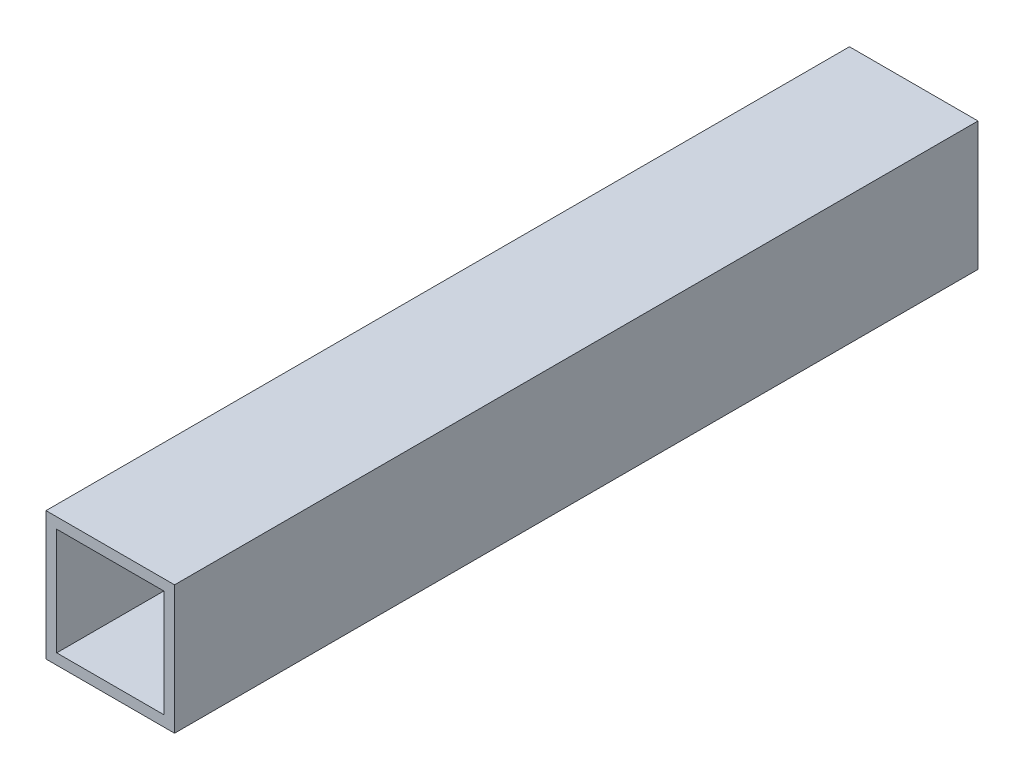
ISO-10303-21;
HEADER;
FILE_DESCRIPTION(('STEP AP214'),'2;1');
FILE_NAME('part.step','',(''),(''),'','','');
FILE_SCHEMA(('AUTOMOTIVE_DESIGN { 1 0 10303 214 1 1 1 1 }'));
ENDSEC;
DATA;
#1=APPLICATION_CONTEXT('core data for automotive mechanical design processes');
#2=APPLICATION_PROTOCOL_DEFINITION('international standard','automotive_design',2000,#1);
#3=PRODUCT_CONTEXT('',#1,'mechanical');
#4=PRODUCT('Part','Part','',(#3));
#5=PRODUCT_RELATED_PRODUCT_CATEGORY('part','',(#4));
#6=PRODUCT_DEFINITION_FORMATION('','',#4);
#7=PRODUCT_DEFINITION_CONTEXT('part definition',#1,'design');
#8=PRODUCT_DEFINITION('design','',#6,#7);
#9=PRODUCT_DEFINITION_SHAPE('','',#8);
#10=(LENGTH_UNIT() NAMED_UNIT(*) SI_UNIT(.MILLI.,.METRE.));
#11=(NAMED_UNIT(*) PLANE_ANGLE_UNIT() SI_UNIT($,.RADIAN.));
#12=(NAMED_UNIT(*) SI_UNIT($,.STERADIAN.) SOLID_ANGLE_UNIT());
#13=UNCERTAINTY_MEASURE_WITH_UNIT(LENGTH_MEASURE(1.E-05),#10,'distance_accuracy_value','');
#14=(GEOMETRIC_REPRESENTATION_CONTEXT(3) GLOBAL_UNCERTAINTY_ASSIGNED_CONTEXT((#13)) GLOBAL_UNIT_ASSIGNED_CONTEXT((#10,
#11,#12)) REPRESENTATION_CONTEXT('',''));
#15=CARTESIAN_POINT('',(0.,0.,0.));
#16=DIRECTION('',(0.,0.,1.));
#17=DIRECTION('',(1.,0.,0.));
#18=AXIS2_PLACEMENT_3D('',#15,#16,#17);
#19=CARTESIAN_POINT('',(0.,0.,75.));
#20=DIRECTION('',(0.,0.,1.));
#21=DIRECTION('',(1.,0.,0.));
#22=AXIS2_PLACEMENT_3D('',#19,#20,#21);
#23=PLANE('',#22);
#24=DIRECTION('',(0.,-1.,0.));
#25=VECTOR('',#24,1.);
#26=CARTESIAN_POINT('',(-12.,12.,75.));
#27=LINE('',#26,#25);
#28=CARTESIAN_POINT('',(-12.,12.,75.));
#29=VERTEX_POINT('',#28);
#30=CARTESIAN_POINT('',(-12.,-12.,75.));
#31=VERTEX_POINT('',#30);
#32=EDGE_CURVE('E136',#29,#31,#27,.T.);
#33=ORIENTED_EDGE('',*,*,#32,.T.);
#34=DIRECTION('',(1.,0.,0.));
#35=VECTOR('',#34,1.);
#36=CARTESIAN_POINT('',(-12.,-12.,75.));
#37=LINE('',#36,#35);
#38=CARTESIAN_POINT('',(12.,-12.,75.));
#39=VERTEX_POINT('',#38);
#40=EDGE_CURVE('E139',#31,#39,#37,.T.);
#41=ORIENTED_EDGE('',*,*,#40,.T.);
#42=DIRECTION('',(0.,1.,0.));
#43=VECTOR('',#42,1.);
#44=CARTESIAN_POINT('',(12.,12.,75.));
#45=LINE('',#44,#43);
#46=CARTESIAN_POINT('',(12.,12.,75.));
#47=VERTEX_POINT('',#46);
#48=EDGE_CURVE('E142',#39,#47,#45,.T.);
#49=ORIENTED_EDGE('',*,*,#48,.T.);
#50=DIRECTION('',(-1.,0.,0.));
#51=VECTOR('',#50,1.);
#52=CARTESIAN_POINT('',(-12.,12.,75.));
#53=LINE('',#52,#51);
#54=EDGE_CURVE('E144',#47,#29,#53,.T.);
#55=ORIENTED_EDGE('',*,*,#54,.T.);
#56=EDGE_LOOP('',(#33,#41,#49,#55));
#57=FACE_BOUND('',#56,.T.);
#58=DIRECTION('',(-1.,0.,0.));
#59=VECTOR('',#58,1.);
#60=CARTESIAN_POINT('',(-10.,10.,75.));
#61=LINE('',#60,#59);
#62=CARTESIAN_POINT('',(10.,10.,75.));
#63=VERTEX_POINT('',#62);
#64=CARTESIAN_POINT('',(-10.,10.,75.));
#65=VERTEX_POINT('',#64);
#66=EDGE_CURVE('E108',#63,#65,#61,.T.);
#67=ORIENTED_EDGE('',*,*,#66,.F.);
#68=DIRECTION('',(0.,1.,0.));
#69=VECTOR('',#68,1.);
#70=CARTESIAN_POINT('',(10.,10.,75.));
#71=LINE('',#70,#69);
#72=CARTESIAN_POINT('',(10.,-10.,75.));
#73=VERTEX_POINT('',#72);
#74=EDGE_CURVE('E100',#73,#63,#71,.T.);
#75=ORIENTED_EDGE('',*,*,#74,.F.);
#76=DIRECTION('',(1.,0.,0.));
#77=VECTOR('',#76,1.);
#78=CARTESIAN_POINT('',(-10.,-10.,75.));
#79=LINE('',#78,#77);
#80=CARTESIAN_POINT('',(-10.,-10.,75.));
#81=VERTEX_POINT('',#80);
#82=EDGE_CURVE('E122',#81,#73,#79,.T.);
#83=ORIENTED_EDGE('',*,*,#82,.F.);
#84=DIRECTION('',(0.,-1.,0.));
#85=VECTOR('',#84,1.);
#86=CARTESIAN_POINT('',(-10.,10.,75.));
#87=LINE('',#86,#85);
#88=EDGE_CURVE('E120',#65,#81,#87,.T.);
#89=ORIENTED_EDGE('',*,*,#88,.F.);
#90=EDGE_LOOP('',(#67,#75,#83,#89));
#91=FACE_BOUND('',#90,.T.);
#92=ADVANCED_FACE('F35',(#57,#91),#23,.T.);
#93=CARTESIAN_POINT('',(0.,0.,-75.));
#94=DIRECTION('',(0.,0.,1.));
#95=DIRECTION('',(1.,0.,0.));
#96=AXIS2_PLACEMENT_3D('',#93,#94,#95);
#97=PLANE('',#96);
#98=DIRECTION('',(0.,-1.,0.));
#99=VECTOR('',#98,1.);
#100=CARTESIAN_POINT('',(-12.,12.,-75.));
#101=LINE('',#100,#99);
#102=CARTESIAN_POINT('',(-12.,12.,-75.));
#103=VERTEX_POINT('',#102);
#104=CARTESIAN_POINT('',(-12.,-12.,-75.));
#105=VERTEX_POINT('',#104);
#106=EDGE_CURVE('E116',#103,#105,#101,.T.);
#107=ORIENTED_EDGE('',*,*,#106,.F.);
#108=DIRECTION('',(-1.,0.,0.));
#109=VECTOR('',#108,1.);
#110=CARTESIAN_POINT('',(-12.,12.,-75.));
#111=LINE('',#110,#109);
#112=CARTESIAN_POINT('',(12.,12.,-75.));
#113=VERTEX_POINT('',#112);
#114=EDGE_CURVE('E140',#113,#103,#111,.T.);
#115=ORIENTED_EDGE('',*,*,#114,.F.);
#116=DIRECTION('',(0.,1.,0.));
#117=VECTOR('',#116,1.);
#118=CARTESIAN_POINT('',(12.,12.,-75.));
#119=LINE('',#118,#117);
#120=CARTESIAN_POINT('',(12.,-12.,-75.));
#121=VERTEX_POINT('',#120);
#122=EDGE_CURVE('E151',#121,#113,#119,.T.);
#123=ORIENTED_EDGE('',*,*,#122,.F.);
#124=DIRECTION('',(1.,0.,0.));
#125=VECTOR('',#124,1.);
#126=CARTESIAN_POINT('',(-12.,-12.,-75.));
#127=LINE('',#126,#125);
#128=EDGE_CURVE('E149',#105,#121,#127,.T.);
#129=ORIENTED_EDGE('',*,*,#128,.F.);
#130=EDGE_LOOP('',(#107,#115,#123,#129));
#131=FACE_BOUND('',#130,.T.);
#132=DIRECTION('',(0.,1.,0.));
#133=VECTOR('',#132,1.);
#134=CARTESIAN_POINT('',(10.,10.,-75.));
#135=LINE('',#134,#133);
#136=CARTESIAN_POINT('',(10.,-10.,-75.));
#137=VERTEX_POINT('',#136);
#138=CARTESIAN_POINT('',(10.,10.,-75.));
#139=VERTEX_POINT('',#138);
#140=EDGE_CURVE('E58',#137,#139,#135,.T.);
#141=ORIENTED_EDGE('',*,*,#140,.T.);
#142=DIRECTION('',(-1.,0.,0.));
#143=VECTOR('',#142,1.);
#144=CARTESIAN_POINT('',(-10.,10.,-75.));
#145=LINE('',#144,#143);
#146=CARTESIAN_POINT('',(-10.,10.,-75.));
#147=VERTEX_POINT('',#146);
#148=EDGE_CURVE('E115',#139,#147,#145,.T.);
#149=ORIENTED_EDGE('',*,*,#148,.T.);
#150=DIRECTION('',(0.,-1.,0.));
#151=VECTOR('',#150,1.);
#152=CARTESIAN_POINT('',(-10.,10.,-75.));
#153=LINE('',#152,#151);
#154=CARTESIAN_POINT('',(-10.,-10.,-75.));
#155=VERTEX_POINT('',#154);
#156=EDGE_CURVE('E128',#147,#155,#153,.T.);
#157=ORIENTED_EDGE('',*,*,#156,.T.);
#158=DIRECTION('',(1.,0.,0.));
#159=VECTOR('',#158,1.);
#160=CARTESIAN_POINT('',(-10.,-10.,-75.));
#161=LINE('',#160,#159);
#162=EDGE_CURVE('E109',#155,#137,#161,.T.);
#163=ORIENTED_EDGE('',*,*,#162,.T.);
#164=EDGE_LOOP('',(#141,#149,#157,#163));
#165=FACE_BOUND('',#164,.T.);
#166=ADVANCED_FACE('F169',(#131,#165),#97,.F.);
#167=CARTESIAN_POINT('',(-12.,12.,75.));
#168=DIRECTION('',(1.,0.,0.));
#169=DIRECTION('',(0.,1.,0.));
#170=AXIS2_PLACEMENT_3D('',#167,#168,#169);
#171=PLANE('',#170);
#172=ORIENTED_EDGE('',*,*,#106,.T.);
#173=DIRECTION('',(0.,0.,-1.));
#174=VECTOR('',#173,1.);
#175=CARTESIAN_POINT('',(-12.,-12.,75.));
#176=LINE('',#175,#174);
#177=EDGE_CURVE('E11',#31,#105,#176,.T.);
#178=ORIENTED_EDGE('',*,*,#177,.F.);
#179=ORIENTED_EDGE('',*,*,#32,.F.);
#180=DIRECTION('',(0.,0.,-1.));
#181=VECTOR('',#180,1.);
#182=CARTESIAN_POINT('',(-12.,12.,75.));
#183=LINE('',#182,#181);
#184=EDGE_CURVE('E146',#29,#103,#183,.T.);
#185=ORIENTED_EDGE('',*,*,#184,.T.);
#186=EDGE_LOOP('',(#172,#178,#179,#185));
#187=FACE_BOUND('',#186,.T.);
#188=ADVANCED_FACE('F37',(#187),#171,.F.);
#189=CARTESIAN_POINT('',(-12.,-12.,75.));
#190=DIRECTION('',(0.,1.,0.));
#191=DIRECTION('',(-1.,0.,0.));
#192=AXIS2_PLACEMENT_3D('',#189,#190,#191);
#193=PLANE('',#192);
#194=ORIENTED_EDGE('',*,*,#128,.T.);
#195=DIRECTION('',(0.,0.,-1.));
#196=VECTOR('',#195,1.);
#197=CARTESIAN_POINT('',(12.,-12.,75.));
#198=LINE('',#197,#196);
#199=EDGE_CURVE('E43',#39,#121,#198,.T.);
#200=ORIENTED_EDGE('',*,*,#199,.F.);
#201=ORIENTED_EDGE('',*,*,#40,.F.);
#202=ORIENTED_EDGE('',*,*,#177,.T.);
#203=EDGE_LOOP('',(#194,#200,#201,#202));
#204=FACE_BOUND('',#203,.T.);
#205=ADVANCED_FACE('F179',(#204),#193,.F.);
#206=CARTESIAN_POINT('',(12.,12.,75.));
#207=DIRECTION('',(-1.,0.,0.));
#208=DIRECTION('',(0.,-1.,0.));
#209=AXIS2_PLACEMENT_3D('',#206,#207,#208);
#210=PLANE('',#209);
#211=ORIENTED_EDGE('',*,*,#122,.T.);
#212=DIRECTION('',(0.,0.,-1.));
#213=VECTOR('',#212,1.);
#214=CARTESIAN_POINT('',(12.,12.,75.));
#215=LINE('',#214,#213);
#216=EDGE_CURVE('E156',#47,#113,#215,.T.);
#217=ORIENTED_EDGE('',*,*,#216,.F.);
#218=ORIENTED_EDGE('',*,*,#48,.F.);
#219=ORIENTED_EDGE('',*,*,#199,.T.);
#220=EDGE_LOOP('',(#211,#217,#218,#219));
#221=FACE_BOUND('',#220,.T.);
#222=ADVANCED_FACE('F163',(#221),#210,.F.);
#223=CARTESIAN_POINT('',(-12.,12.,75.));
#224=DIRECTION('',(0.,-1.,0.));
#225=DIRECTION('',(0.,0.,-1.));
#226=AXIS2_PLACEMENT_3D('',#223,#224,#225);
#227=PLANE('',#226);
#228=ORIENTED_EDGE('',*,*,#114,.T.);
#229=ORIENTED_EDGE('',*,*,#184,.F.);
#230=ORIENTED_EDGE('',*,*,#54,.F.);
#231=ORIENTED_EDGE('',*,*,#216,.T.);
#232=EDGE_LOOP('',(#228,#229,#230,#231));
#233=FACE_BOUND('',#232,.T.);
#234=ADVANCED_FACE('F173',(#233),#227,.F.);
#235=CARTESIAN_POINT('',(10.,10.,75.));
#236=DIRECTION('',(-1.,0.,0.));
#237=DIRECTION('',(0.,0.,1.));
#238=AXIS2_PLACEMENT_3D('',#235,#236,#237);
#239=PLANE('',#238);
#240=ORIENTED_EDGE('',*,*,#140,.F.);
#241=DIRECTION('',(0.,0.,-1.));
#242=VECTOR('',#241,1.);
#243=CARTESIAN_POINT('',(10.,-10.,75.));
#244=LINE('',#243,#242);
#245=EDGE_CURVE('E104',#73,#137,#244,.T.);
#246=ORIENTED_EDGE('',*,*,#245,.F.);
#247=ORIENTED_EDGE('',*,*,#74,.T.);
#248=DIRECTION('',(0.,0.,-1.));
#249=VECTOR('',#248,1.);
#250=CARTESIAN_POINT('',(10.,10.,75.));
#251=LINE('',#250,#249);
#252=EDGE_CURVE('E103',#63,#139,#251,.T.);
#253=ORIENTED_EDGE('',*,*,#252,.T.);
#254=EDGE_LOOP('',(#240,#246,#247,#253));
#255=FACE_BOUND('',#254,.T.);
#256=ADVANCED_FACE('F102',(#255),#239,.T.);
#257=CARTESIAN_POINT('',(-10.,10.,75.));
#258=DIRECTION('',(0.,-1.,0.));
#259=DIRECTION('',(0.,0.,-1.));
#260=AXIS2_PLACEMENT_3D('',#257,#258,#259);
#261=PLANE('',#260);
#262=ORIENTED_EDGE('',*,*,#148,.F.);
#263=ORIENTED_EDGE('',*,*,#252,.F.);
#264=ORIENTED_EDGE('',*,*,#66,.T.);
#265=DIRECTION('',(0.,0.,-1.));
#266=VECTOR('',#265,1.);
#267=CARTESIAN_POINT('',(-10.,10.,75.));
#268=LINE('',#267,#266);
#269=EDGE_CURVE('E117',#65,#147,#268,.T.);
#270=ORIENTED_EDGE('',*,*,#269,.T.);
#271=EDGE_LOOP('',(#262,#263,#264,#270));
#272=FACE_BOUND('',#271,.T.);
#273=ADVANCED_FACE('F112',(#272),#261,.T.);
#274=CARTESIAN_POINT('',(-10.,10.,75.));
#275=DIRECTION('',(1.,0.,0.));
#276=DIRECTION('',(0.,1.,0.));
#277=AXIS2_PLACEMENT_3D('',#274,#275,#276);
#278=PLANE('',#277);
#279=ORIENTED_EDGE('',*,*,#156,.F.);
#280=ORIENTED_EDGE('',*,*,#269,.F.);
#281=ORIENTED_EDGE('',*,*,#88,.T.);
#282=DIRECTION('',(0.,0.,-1.));
#283=VECTOR('',#282,1.);
#284=CARTESIAN_POINT('',(-10.,-10.,75.));
#285=LINE('',#284,#283);
#286=EDGE_CURVE('E50',#81,#155,#285,.T.);
#287=ORIENTED_EDGE('',*,*,#286,.T.);
#288=EDGE_LOOP('',(#279,#280,#281,#287));
#289=FACE_BOUND('',#288,.T.);
#290=ADVANCED_FACE('F202',(#289),#278,.T.);
#291=CARTESIAN_POINT('',(-10.,-10.,75.));
#292=DIRECTION('',(0.,1.,0.));
#293=DIRECTION('',(0.,0.,1.));
#294=AXIS2_PLACEMENT_3D('',#291,#292,#293);
#295=PLANE('',#294);
#296=ORIENTED_EDGE('',*,*,#162,.F.);
#297=ORIENTED_EDGE('',*,*,#286,.F.);
#298=ORIENTED_EDGE('',*,*,#82,.T.);
#299=ORIENTED_EDGE('',*,*,#245,.T.);
#300=EDGE_LOOP('',(#296,#297,#298,#299));
#301=FACE_BOUND('',#300,.T.);
#302=ADVANCED_FACE('F206',(#301),#295,.T.);
#303=CLOSED_SHELL('',(#92,#166,#188,#205,#222,#234,#256,#273,#290,#302));
#304=MANIFOLD_SOLID_BREP('B2',#303);
#305=ADVANCED_BREP_SHAPE_REPRESENTATION('',(#18,#304),#14);
#306=SHAPE_DEFINITION_REPRESENTATION(#9,#305);
ENDSEC;
END-ISO-10303-21;
